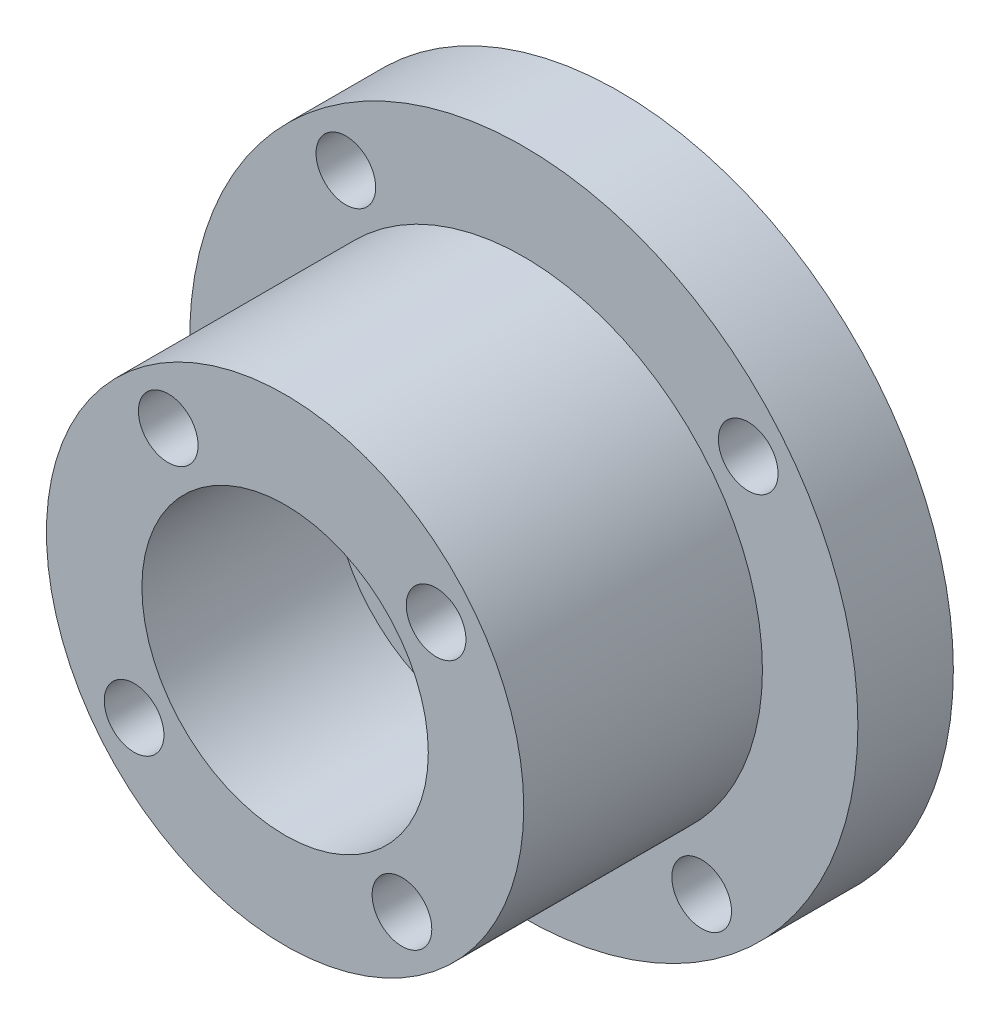
ISO-10303-21;
HEADER;
FILE_DESCRIPTION(('STEP AP214'),'2;1');
FILE_NAME('part.step','',(''),(''),'','','');
FILE_SCHEMA(('AUTOMOTIVE_DESIGN { 1 0 10303 214 1 1 1 1 }'));
ENDSEC;
DATA;
#1=APPLICATION_CONTEXT('core data for automotive mechanical design processes');
#2=APPLICATION_PROTOCOL_DEFINITION('international standard','automotive_design',2000,#1);
#3=PRODUCT_CONTEXT('',#1,'mechanical');
#4=PRODUCT('Part','Part','',(#3));
#5=PRODUCT_RELATED_PRODUCT_CATEGORY('part','',(#4));
#6=PRODUCT_DEFINITION_FORMATION('','',#4);
#7=PRODUCT_DEFINITION_CONTEXT('part definition',#1,'design');
#8=PRODUCT_DEFINITION('design','',#6,#7);
#9=PRODUCT_DEFINITION_SHAPE('','',#8);
#10=(LENGTH_UNIT() NAMED_UNIT(*) SI_UNIT(.MILLI.,.METRE.));
#11=(NAMED_UNIT(*) PLANE_ANGLE_UNIT() SI_UNIT($,.RADIAN.));
#12=(NAMED_UNIT(*) SI_UNIT($,.STERADIAN.) SOLID_ANGLE_UNIT());
#13=UNCERTAINTY_MEASURE_WITH_UNIT(LENGTH_MEASURE(1.E-05),#10,'distance_accuracy_value','');
#14=(GEOMETRIC_REPRESENTATION_CONTEXT(3) GLOBAL_UNCERTAINTY_ASSIGNED_CONTEXT((#13)) GLOBAL_UNIT_ASSIGNED_CONTEXT((#10,
#11,#12)) REPRESENTATION_CONTEXT('',''));
#15=CARTESIAN_POINT('',(0.,0.,0.));
#16=DIRECTION('',(0.,0.,1.));
#17=DIRECTION('',(1.,0.,0.));
#18=AXIS2_PLACEMENT_3D('',#15,#16,#17);
#19=CARTESIAN_POINT('',(0.,0.,0.));
#20=DIRECTION('',(0.,0.,1.));
#21=DIRECTION('',(1.,0.,0.));
#22=AXIS2_PLACEMENT_3D('',#19,#20,#21);
#23=CYLINDRICAL_SURFACE('',#22,2.5);
#24=CARTESIAN_POINT('',(0.,0.,0.));
#25=DIRECTION('',(0.,0.,1.));
#26=DIRECTION('',(1.,0.,0.));
#27=AXIS2_PLACEMENT_3D('',#24,#25,#26);
#28=CIRCLE('',#27,2.5);
#29=CARTESIAN_POINT('',(2.5,0.,0.));
#30=VERTEX_POINT('',#29);
#31=EDGE_CURVE('E53',#30,#30,#28,.T.);
#32=ORIENTED_EDGE('',*,*,#31,.F.);
#33=EDGE_LOOP('',(#32));
#34=FACE_BOUND('',#33,.T.);
#35=CARTESIAN_POINT('',(0.,0.,6.));
#36=DIRECTION('',(0.,0.,1.));
#37=DIRECTION('',(1.,0.,0.));
#38=AXIS2_PLACEMENT_3D('',#35,#36,#37);
#39=CIRCLE('',#38,2.5);
#40=CARTESIAN_POINT('',(2.5,0.,6.));
#41=VERTEX_POINT('',#40);
#42=EDGE_CURVE('E50',#41,#41,#39,.F.);
#43=ORIENTED_EDGE('',*,*,#42,.F.);
#44=EDGE_LOOP('',(#43));
#45=FACE_BOUND('',#44,.T.);
#46=ADVANCED_FACE('F31',(#34,#45),#23,.F.);
#47=CARTESIAN_POINT('',(0.,0.,4.));
#48=DIRECTION('',(0.,0.,-1.));
#49=DIRECTION('',(-1.,0.,0.));
#50=AXIS2_PLACEMENT_3D('',#47,#48,#49);
#51=CYLINDRICAL_SURFACE('',#50,14.);
#52=CARTESIAN_POINT('',(0.,0.,4.));
#53=DIRECTION('',(0.,0.,1.));
#54=DIRECTION('',(1.,0.,0.));
#55=AXIS2_PLACEMENT_3D('',#52,#53,#54);
#56=CIRCLE('',#55,14.);
#57=CARTESIAN_POINT('',(14.,0.,4.));
#58=VERTEX_POINT('',#57);
#59=EDGE_CURVE('E10',#58,#58,#56,.T.);
#60=ORIENTED_EDGE('',*,*,#59,.F.);
#61=EDGE_LOOP('',(#60));
#62=FACE_BOUND('',#61,.T.);
#63=CARTESIAN_POINT('',(0.,0.,0.));
#64=DIRECTION('',(0.,0.,1.));
#65=DIRECTION('',(1.,0.,0.));
#66=AXIS2_PLACEMENT_3D('',#63,#64,#65);
#67=CIRCLE('',#66,14.);
#68=CARTESIAN_POINT('',(14.,0.,0.));
#69=VERTEX_POINT('',#68);
#70=EDGE_CURVE('E39',#69,#69,#67,.T.);
#71=ORIENTED_EDGE('',*,*,#70,.T.);
#72=EDGE_LOOP('',(#71));
#73=FACE_BOUND('',#72,.T.);
#74=ADVANCED_FACE('F33',(#62,#73),#51,.T.);
#75=CARTESIAN_POINT('',(0.,0.,4.));
#76=DIRECTION('',(0.,0.,1.));
#77=DIRECTION('',(1.,0.,0.));
#78=AXIS2_PLACEMENT_3D('',#75,#76,#77);
#79=PLANE('',#78);
#80=CARTESIAN_POINT('',(7.45398948367176,-9.40415018900223,4.));
#81=DIRECTION('',(0.,0.,1.));
#82=DIRECTION('',(1.,0.,0.));
#83=AXIS2_PLACEMENT_3D('',#80,#81,#82);
#84=CIRCLE('',#83,1.25);
#85=CARTESIAN_POINT('',(8.70398948367176,-9.40415018900223,4.));
#86=VERTEX_POINT('',#85);
#87=EDGE_CURVE('E75',#86,#86,#84,.T.);
#88=ORIENTED_EDGE('',*,*,#87,.F.);
#89=EDGE_LOOP('',(#88));
#90=FACE_BOUND('',#89,.T.);
#91=CARTESIAN_POINT('',(9.40415018900221,7.4539894836718,4.));
#92=DIRECTION('',(0.,0.,1.));
#93=DIRECTION('',(1.,0.,0.));
#94=AXIS2_PLACEMENT_3D('',#91,#92,#93);
#95=CIRCLE('',#94,1.25);
#96=CARTESIAN_POINT('',(10.6541501890022,7.4539894836718,4.));
#97=VERTEX_POINT('',#96);
#98=EDGE_CURVE('E65',#97,#97,#95,.T.);
#99=ORIENTED_EDGE('',*,*,#98,.F.);
#100=EDGE_LOOP('',(#99));
#101=FACE_BOUND('',#100,.T.);
#102=CARTESIAN_POINT('',(-7.45398948367183,9.40415018900218,4.));
#103=DIRECTION('',(0.,0.,1.));
#104=DIRECTION('',(1.,0.,0.));
#105=AXIS2_PLACEMENT_3D('',#102,#103,#104);
#106=CIRCLE('',#105,1.25);
#107=CARTESIAN_POINT('',(-6.20398948367183,9.40415018900218,4.));
#108=VERTEX_POINT('',#107);
#109=EDGE_CURVE('E62',#108,#108,#106,.T.);
#110=ORIENTED_EDGE('',*,*,#109,.F.);
#111=EDGE_LOOP('',(#110));
#112=FACE_BOUND('',#111,.T.);
#113=CARTESIAN_POINT('',(-9.40415018900216,-7.45398948367186,4.));
#114=DIRECTION('',(0.,0.,1.));
#115=DIRECTION('',(1.,0.,0.));
#116=AXIS2_PLACEMENT_3D('',#113,#114,#115);
#117=CIRCLE('',#116,1.25);
#118=CARTESIAN_POINT('',(-8.15415018900216,-7.45398948367186,4.));
#119=VERTEX_POINT('',#118);
#120=EDGE_CURVE('E59',#119,#119,#117,.T.);
#121=ORIENTED_EDGE('',*,*,#120,.F.);
#122=EDGE_LOOP('',(#121));
#123=FACE_BOUND('',#122,.T.);
#124=CARTESIAN_POINT('',(0.,0.,4.));
#125=DIRECTION('',(0.,0.,1.));
#126=DIRECTION('',(1.,0.,0.));
#127=AXIS2_PLACEMENT_3D('',#124,#125,#126);
#128=CIRCLE('',#127,10.);
#129=CARTESIAN_POINT('',(10.,0.,4.));
#130=VERTEX_POINT('',#129);
#131=EDGE_CURVE('E47',#130,#130,#128,.T.);
#132=ORIENTED_EDGE('',*,*,#131,.F.);
#133=EDGE_LOOP('',(#132));
#134=FACE_BOUND('',#133,.T.);
#135=ORIENTED_EDGE('',*,*,#59,.T.);
#136=EDGE_LOOP('',(#135));
#137=FACE_BOUND('',#136,.T.);
#138=ADVANCED_FACE('F94',(#90,#101,#112,#123,#134,#137),#79,.T.);
#139=CARTESIAN_POINT('',(0.,0.,0.));
#140=DIRECTION('',(0.,0.,1.));
#141=DIRECTION('',(1.,0.,0.));
#142=AXIS2_PLACEMENT_3D('',#139,#140,#141);
#143=PLANE('',#142);
#144=CARTESIAN_POINT('',(7.45398948367176,-9.40415018900223,0.));
#145=DIRECTION('',(0.,0.,1.));
#146=DIRECTION('',(1.,0.,0.));
#147=AXIS2_PLACEMENT_3D('',#144,#145,#146);
#148=CIRCLE('',#147,1.25);
#149=CARTESIAN_POINT('',(8.70398948367176,-9.40415018900223,0.));
#150=VERTEX_POINT('',#149);
#151=EDGE_CURVE('E35',#150,#150,#148,.T.);
#152=ORIENTED_EDGE('',*,*,#151,.T.);
#153=EDGE_LOOP('',(#152));
#154=FACE_BOUND('',#153,.T.);
#155=CARTESIAN_POINT('',(9.40415018900221,7.4539894836718,0.));
#156=DIRECTION('',(0.,0.,1.));
#157=DIRECTION('',(1.,0.,0.));
#158=AXIS2_PLACEMENT_3D('',#155,#156,#157);
#159=CIRCLE('',#158,1.25);
#160=CARTESIAN_POINT('',(10.6541501890022,7.4539894836718,0.));
#161=VERTEX_POINT('',#160);
#162=EDGE_CURVE('E63',#161,#161,#159,.T.);
#163=ORIENTED_EDGE('',*,*,#162,.T.);
#164=EDGE_LOOP('',(#163));
#165=FACE_BOUND('',#164,.T.);
#166=CARTESIAN_POINT('',(-7.45398948367183,9.40415018900218,0.));
#167=DIRECTION('',(0.,0.,1.));
#168=DIRECTION('',(1.,0.,0.));
#169=AXIS2_PLACEMENT_3D('',#166,#167,#168);
#170=CIRCLE('',#169,1.25);
#171=CARTESIAN_POINT('',(-6.20398948367183,9.40415018900218,0.));
#172=VERTEX_POINT('',#171);
#173=EDGE_CURVE('E60',#172,#172,#170,.T.);
#174=ORIENTED_EDGE('',*,*,#173,.T.);
#175=EDGE_LOOP('',(#174));
#176=FACE_BOUND('',#175,.T.);
#177=CARTESIAN_POINT('',(-9.40415018900216,-7.45398948367186,0.));
#178=DIRECTION('',(0.,0.,1.));
#179=DIRECTION('',(1.,0.,0.));
#180=AXIS2_PLACEMENT_3D('',#177,#178,#179);
#181=CIRCLE('',#180,1.25);
#182=CARTESIAN_POINT('',(-8.15415018900216,-7.45398948367186,0.));
#183=VERTEX_POINT('',#182);
#184=EDGE_CURVE('E55',#183,#183,#181,.T.);
#185=ORIENTED_EDGE('',*,*,#184,.T.);
#186=EDGE_LOOP('',(#185));
#187=FACE_BOUND('',#186,.T.);
#188=ORIENTED_EDGE('',*,*,#31,.T.);
#189=EDGE_LOOP('',(#188));
#190=FACE_BOUND('',#189,.T.);
#191=ORIENTED_EDGE('',*,*,#70,.F.);
#192=EDGE_LOOP('',(#191));
#193=FACE_BOUND('',#192,.T.);
#194=ADVANCED_FACE('F96',(#154,#165,#176,#187,#190,#193),#143,.F.);
#195=CARTESIAN_POINT('',(0.,0.,14.));
#196=DIRECTION('',(0.,0.,-1.));
#197=DIRECTION('',(-1.,0.,0.));
#198=AXIS2_PLACEMENT_3D('',#195,#196,#197);
#199=CYLINDRICAL_SURFACE('',#198,10.);
#200=CARTESIAN_POINT('',(0.,0.,14.));
#201=DIRECTION('',(0.,0.,1.));
#202=DIRECTION('',(1.,0.,0.));
#203=AXIS2_PLACEMENT_3D('',#200,#201,#202);
#204=CIRCLE('',#203,10.);
#205=CARTESIAN_POINT('',(10.,0.,14.));
#206=VERTEX_POINT('',#205);
#207=EDGE_CURVE('E44',#206,#206,#204,.T.);
#208=ORIENTED_EDGE('',*,*,#207,.F.);
#209=EDGE_LOOP('',(#208));
#210=FACE_BOUND('',#209,.T.);
#211=ORIENTED_EDGE('',*,*,#131,.T.);
#212=EDGE_LOOP('',(#211));
#213=FACE_BOUND('',#212,.T.);
#214=ADVANCED_FACE('F92',(#210,#213),#199,.T.);
#215=CARTESIAN_POINT('',(0.,0.,14.));
#216=DIRECTION('',(0.,0.,1.));
#217=DIRECTION('',(1.,0.,0.));
#218=AXIS2_PLACEMENT_3D('',#215,#216,#217);
#219=PLANE('',#218);
#220=CARTESIAN_POINT('',(4.89619427743065,-6.32671175237622,14.));
#221=DIRECTION('',(0.,0.,1.));
#222=DIRECTION('',(1.,0.,0.));
#223=AXIS2_PLACEMENT_3D('',#220,#221,#222);
#224=CIRCLE('',#223,1.25);
#225=CARTESIAN_POINT('',(6.14619427743065,-6.32671175237622,14.));
#226=VERTEX_POINT('',#225);
#227=EDGE_CURVE('E282',#226,#226,#224,.T.);
#228=ORIENTED_EDGE('',*,*,#227,.F.);
#229=EDGE_LOOP('',(#228));
#230=FACE_BOUND('',#229,.T.);
#231=CARTESIAN_POINT('',(6.3267117523762,4.89619427743067,14.));
#232=DIRECTION('',(0.,0.,1.));
#233=DIRECTION('',(1.,0.,0.));
#234=AXIS2_PLACEMENT_3D('',#231,#232,#233);
#235=CIRCLE('',#234,1.25);
#236=CARTESIAN_POINT('',(7.5767117523762,4.89619427743067,14.));
#237=VERTEX_POINT('',#236);
#238=EDGE_CURVE('E281',#237,#237,#235,.T.);
#239=ORIENTED_EDGE('',*,*,#238,.F.);
#240=EDGE_LOOP('',(#239));
#241=FACE_BOUND('',#240,.T.);
#242=CARTESIAN_POINT('',(-4.89619427743069,6.32671175237619,14.));
#243=DIRECTION('',(0.,0.,1.));
#244=DIRECTION('',(1.,0.,0.));
#245=AXIS2_PLACEMENT_3D('',#242,#243,#244);
#246=CIRCLE('',#245,1.25);
#247=CARTESIAN_POINT('',(-3.64619427743069,6.32671175237619,14.));
#248=VERTEX_POINT('',#247);
#249=EDGE_CURVE('E291',#248,#248,#246,.T.);
#250=ORIENTED_EDGE('',*,*,#249,.F.);
#251=EDGE_LOOP('',(#250));
#252=FACE_BOUND('',#251,.T.);
#253=CARTESIAN_POINT('',(-6.32671175237617,-4.89619427743071,14.));
#254=DIRECTION('',(0.,0.,1.));
#255=DIRECTION('',(1.,0.,0.));
#256=AXIS2_PLACEMENT_3D('',#253,#254,#255);
#257=CIRCLE('',#256,1.25);
#258=CARTESIAN_POINT('',(-5.07671175237617,-4.89619427743071,14.));
#259=VERTEX_POINT('',#258);
#260=EDGE_CURVE('E296',#259,#259,#257,.T.);
#261=ORIENTED_EDGE('',*,*,#260,.F.);
#262=EDGE_LOOP('',(#261));
#263=FACE_BOUND('',#262,.T.);
#264=CARTESIAN_POINT('',(0.,0.,14.));
#265=DIRECTION('',(0.,0.,1.));
#266=DIRECTION('',(1.,0.,0.));
#267=AXIS2_PLACEMENT_3D('',#264,#265,#266);
#268=CIRCLE('',#267,6.);
#269=CARTESIAN_POINT('',(6.,0.,14.));
#270=VERTEX_POINT('',#269);
#271=EDGE_CURVE('E58',#270,#270,#268,.T.);
#272=ORIENTED_EDGE('',*,*,#271,.F.);
#273=EDGE_LOOP('',(#272));
#274=FACE_BOUND('',#273,.T.);
#275=ORIENTED_EDGE('',*,*,#207,.T.);
#276=EDGE_LOOP('',(#275));
#277=FACE_BOUND('',#276,.T.);
#278=ADVANCED_FACE('F120',(#230,#241,#252,#263,#274,#277),#219,.T.);
#279=CARTESIAN_POINT('',(0.,0.,6.));
#280=DIRECTION('',(0.,0.,1.));
#281=DIRECTION('',(1.,0.,0.));
#282=AXIS2_PLACEMENT_3D('',#279,#280,#281);
#283=PLANE('',#282);
#284=CARTESIAN_POINT('',(0.,0.,6.));
#285=DIRECTION('',(0.,0.,1.));
#286=DIRECTION('',(1.,0.,0.));
#287=AXIS2_PLACEMENT_3D('',#284,#285,#286);
#288=CIRCLE('',#287,6.);
#289=CARTESIAN_POINT('',(6.,0.,6.));
#290=VERTEX_POINT('',#289);
#291=EDGE_CURVE('E54',#290,#290,#288,.T.);
#292=ORIENTED_EDGE('',*,*,#291,.T.);
#293=EDGE_LOOP('',(#292));
#294=FACE_BOUND('',#293,.T.);
#295=ORIENTED_EDGE('',*,*,#42,.T.);
#296=EDGE_LOOP('',(#295));
#297=FACE_BOUND('',#296,.T.);
#298=ADVANCED_FACE('F122',(#294,#297),#283,.T.);
#299=CARTESIAN_POINT('',(0.,0.,6.));
#300=DIRECTION('',(0.,0.,1.));
#301=DIRECTION('',(1.,0.,0.));
#302=AXIS2_PLACEMENT_3D('',#299,#300,#301);
#303=CYLINDRICAL_SURFACE('',#302,6.);
#304=ORIENTED_EDGE('',*,*,#291,.F.);
#305=EDGE_LOOP('',(#304));
#306=FACE_BOUND('',#305,.T.);
#307=ORIENTED_EDGE('',*,*,#271,.T.);
#308=EDGE_LOOP('',(#307));
#309=FACE_BOUND('',#308,.T.);
#310=ADVANCED_FACE('F118',(#306,#309),#303,.F.);
#311=CARTESIAN_POINT('',(-9.40415018900216,-7.45398948367186,-4.));
#312=DIRECTION('',(0.,0.,1.));
#313=DIRECTION('',(1.,0.,0.));
#314=AXIS2_PLACEMENT_3D('',#311,#312,#313);
#315=CYLINDRICAL_SURFACE('',#314,1.25);
#316=ORIENTED_EDGE('',*,*,#120,.T.);
#317=EDGE_LOOP('',(#316));
#318=FACE_BOUND('',#317,.T.);
#319=ORIENTED_EDGE('',*,*,#184,.F.);
#320=EDGE_LOOP('',(#319));
#321=FACE_BOUND('',#320,.T.);
#322=ADVANCED_FACE('F152',(#318,#321),#315,.F.);
#323=CARTESIAN_POINT('',(-7.45398948367183,9.40415018900218,-4.));
#324=DIRECTION('',(0.,0.,1.));
#325=DIRECTION('',(1.,0.,0.));
#326=AXIS2_PLACEMENT_3D('',#323,#324,#325);
#327=CYLINDRICAL_SURFACE('',#326,1.25);
#328=ORIENTED_EDGE('',*,*,#109,.T.);
#329=EDGE_LOOP('',(#328));
#330=FACE_BOUND('',#329,.T.);
#331=ORIENTED_EDGE('',*,*,#173,.F.);
#332=EDGE_LOOP('',(#331));
#333=FACE_BOUND('',#332,.T.);
#334=ADVANCED_FACE('F159',(#330,#333),#327,.F.);
#335=CARTESIAN_POINT('',(9.40415018900221,7.4539894836718,-4.));
#336=DIRECTION('',(0.,0.,1.));
#337=DIRECTION('',(1.,0.,0.));
#338=AXIS2_PLACEMENT_3D('',#335,#336,#337);
#339=CYLINDRICAL_SURFACE('',#338,1.25);
#340=ORIENTED_EDGE('',*,*,#98,.T.);
#341=EDGE_LOOP('',(#340));
#342=FACE_BOUND('',#341,.T.);
#343=ORIENTED_EDGE('',*,*,#162,.F.);
#344=EDGE_LOOP('',(#343));
#345=FACE_BOUND('',#344,.T.);
#346=ADVANCED_FACE('F167',(#342,#345),#339,.F.);
#347=CARTESIAN_POINT('',(7.45398948367176,-9.40415018900223,-4.));
#348=DIRECTION('',(0.,0.,1.));
#349=DIRECTION('',(1.,0.,0.));
#350=AXIS2_PLACEMENT_3D('',#347,#348,#349);
#351=CYLINDRICAL_SURFACE('',#350,1.25);
#352=ORIENTED_EDGE('',*,*,#87,.T.);
#353=EDGE_LOOP('',(#352));
#354=FACE_BOUND('',#353,.T.);
#355=ORIENTED_EDGE('',*,*,#151,.F.);
#356=EDGE_LOOP('',(#355));
#357=FACE_BOUND('',#356,.T.);
#358=ADVANCED_FACE('F175',(#354,#357),#351,.F.);
#359=CARTESIAN_POINT('',(-6.32671175237617,-4.89619427743071,9.));
#360=DIRECTION('',(0.,0.,1.));
#361=DIRECTION('',(1.,0.,0.));
#362=AXIS2_PLACEMENT_3D('',#359,#360,#361);
#363=CYLINDRICAL_SURFACE('',#362,1.25);
#364=CARTESIAN_POINT('',(-6.32671175237617,-4.89619427743071,9.));
#365=DIRECTION('',(0.,0.,1.));
#366=DIRECTION('',(1.,0.,0.));
#367=AXIS2_PLACEMENT_3D('',#364,#365,#366);
#368=CIRCLE('',#367,1.25);
#369=CARTESIAN_POINT('',(-5.07671175237617,-4.89619427743071,9.));
#370=VERTEX_POINT('',#369);
#371=EDGE_CURVE('E299',#370,#370,#368,.T.);
#372=ORIENTED_EDGE('',*,*,#371,.F.);
#373=EDGE_LOOP('',(#372));
#374=FACE_BOUND('',#373,.T.);
#375=ORIENTED_EDGE('',*,*,#260,.T.);
#376=EDGE_LOOP('',(#375));
#377=FACE_BOUND('',#376,.T.);
#378=ADVANCED_FACE('F181',(#374,#377),#363,.F.);
#379=CARTESIAN_POINT('',(-6.32671175237617,-4.89619427743071,9.));
#380=DIRECTION('',(0.,0.,1.));
#381=DIRECTION('',(1.,0.,0.));
#382=AXIS2_PLACEMENT_3D('',#379,#380,#381);
#383=PLANE('',#382);
#384=ORIENTED_EDGE('',*,*,#371,.T.);
#385=EDGE_LOOP('',(#384));
#386=FACE_BOUND('',#385,.T.);
#387=ADVANCED_FACE('F188',(#386),#383,.T.);
#388=CARTESIAN_POINT('',(-4.89619427743069,6.32671175237619,9.));
#389=DIRECTION('',(0.,0.,1.));
#390=DIRECTION('',(1.,0.,0.));
#391=AXIS2_PLACEMENT_3D('',#388,#389,#390);
#392=CYLINDRICAL_SURFACE('',#391,1.25);
#393=CARTESIAN_POINT('',(-4.89619427743069,6.32671175237619,9.));
#394=DIRECTION('',(0.,0.,1.));
#395=DIRECTION('',(1.,0.,0.));
#396=AXIS2_PLACEMENT_3D('',#393,#394,#395);
#397=CIRCLE('',#396,1.25);
#398=CARTESIAN_POINT('',(-3.64619427743069,6.32671175237619,9.));
#399=VERTEX_POINT('',#398);
#400=EDGE_CURVE('E293',#399,#399,#397,.T.);
#401=ORIENTED_EDGE('',*,*,#400,.F.);
#402=EDGE_LOOP('',(#401));
#403=FACE_BOUND('',#402,.T.);
#404=ORIENTED_EDGE('',*,*,#249,.T.);
#405=EDGE_LOOP('',(#404));
#406=FACE_BOUND('',#405,.T.);
#407=ADVANCED_FACE('F196',(#403,#406),#392,.F.);
#408=CARTESIAN_POINT('',(-4.89619427743069,6.32671175237619,9.));
#409=DIRECTION('',(0.,0.,1.));
#410=DIRECTION('',(1.,0.,0.));
#411=AXIS2_PLACEMENT_3D('',#408,#409,#410);
#412=PLANE('',#411);
#413=ORIENTED_EDGE('',*,*,#400,.T.);
#414=EDGE_LOOP('',(#413));
#415=FACE_BOUND('',#414,.T.);
#416=ADVANCED_FACE('F204',(#415),#412,.T.);
#417=CARTESIAN_POINT('',(6.3267117523762,4.89619427743067,9.));
#418=DIRECTION('',(0.,0.,1.));
#419=DIRECTION('',(1.,0.,0.));
#420=AXIS2_PLACEMENT_3D('',#417,#418,#419);
#421=CYLINDRICAL_SURFACE('',#420,1.25);
#422=CARTESIAN_POINT('',(6.3267117523762,4.89619427743067,9.));
#423=DIRECTION('',(0.,0.,1.));
#424=DIRECTION('',(1.,0.,0.));
#425=AXIS2_PLACEMENT_3D('',#422,#423,#424);
#426=CIRCLE('',#425,1.25);
#427=CARTESIAN_POINT('',(7.5767117523762,4.89619427743067,9.));
#428=VERTEX_POINT('',#427);
#429=EDGE_CURVE('E285',#428,#428,#426,.T.);
#430=ORIENTED_EDGE('',*,*,#429,.F.);
#431=EDGE_LOOP('',(#430));
#432=FACE_BOUND('',#431,.T.);
#433=ORIENTED_EDGE('',*,*,#238,.T.);
#434=EDGE_LOOP('',(#433));
#435=FACE_BOUND('',#434,.T.);
#436=ADVANCED_FACE('F212',(#432,#435),#421,.F.);
#437=CARTESIAN_POINT('',(6.3267117523762,4.89619427743067,9.));
#438=DIRECTION('',(0.,0.,1.));
#439=DIRECTION('',(1.,0.,0.));
#440=AXIS2_PLACEMENT_3D('',#437,#438,#439);
#441=PLANE('',#440);
#442=ORIENTED_EDGE('',*,*,#429,.T.);
#443=EDGE_LOOP('',(#442));
#444=FACE_BOUND('',#443,.T.);
#445=ADVANCED_FACE('F220',(#444),#441,.T.);
#446=CARTESIAN_POINT('',(4.89619427743065,-6.32671175237622,9.));
#447=DIRECTION('',(0.,0.,1.));
#448=DIRECTION('',(1.,0.,0.));
#449=AXIS2_PLACEMENT_3D('',#446,#447,#448);
#450=CYLINDRICAL_SURFACE('',#449,1.25);
#451=CARTESIAN_POINT('',(4.89619427743065,-6.32671175237622,9.));
#452=DIRECTION('',(0.,0.,1.));
#453=DIRECTION('',(1.,0.,0.));
#454=AXIS2_PLACEMENT_3D('',#451,#452,#453);
#455=CIRCLE('',#454,1.25);
#456=CARTESIAN_POINT('',(6.14619427743065,-6.32671175237622,9.));
#457=VERTEX_POINT('',#456);
#458=EDGE_CURVE('E280',#457,#457,#455,.T.);
#459=ORIENTED_EDGE('',*,*,#458,.F.);
#460=EDGE_LOOP('',(#459));
#461=FACE_BOUND('',#460,.T.);
#462=ORIENTED_EDGE('',*,*,#227,.T.);
#463=EDGE_LOOP('',(#462));
#464=FACE_BOUND('',#463,.T.);
#465=ADVANCED_FACE('F228',(#461,#464),#450,.F.);
#466=CARTESIAN_POINT('',(4.89619427743065,-6.32671175237622,9.));
#467=DIRECTION('',(0.,0.,1.));
#468=DIRECTION('',(1.,0.,0.));
#469=AXIS2_PLACEMENT_3D('',#466,#467,#468);
#470=PLANE('',#469);
#471=ORIENTED_EDGE('',*,*,#458,.T.);
#472=EDGE_LOOP('',(#471));
#473=FACE_BOUND('',#472,.T.);
#474=ADVANCED_FACE('F236',(#473),#470,.T.);
#475=CLOSED_SHELL('',(#46,#74,#138,#194,#214,#278,#298,#310,#322,#334,#346,#358,#378,#387,#407,
#416,#436,#445,#465,#474));
#476=MANIFOLD_SOLID_BREP('B2',#475);
#477=ADVANCED_BREP_SHAPE_REPRESENTATION('',(#18,#476),#14);
#478=SHAPE_DEFINITION_REPRESENTATION(#9,#477);
ENDSEC;
END-ISO-10303-21;
